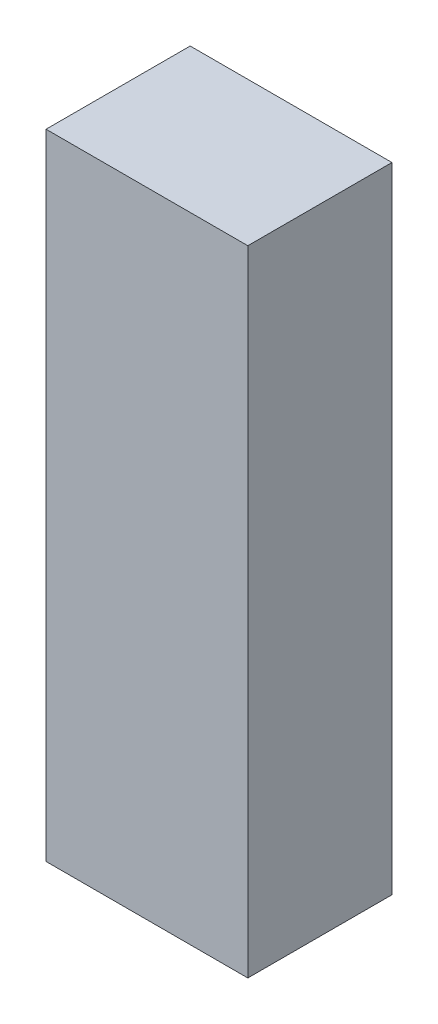
ISO-10303-21;
HEADER;
FILE_DESCRIPTION(('STEP AP214'),'2;1');
FILE_NAME('part.step','',(''),(''),'','','');
FILE_SCHEMA(('AUTOMOTIVE_DESIGN { 1 0 10303 214 1 1 1 1 }'));
ENDSEC;
DATA;
#1=APPLICATION_CONTEXT('core data for automotive mechanical design processes');
#2=APPLICATION_PROTOCOL_DEFINITION('international standard','automotive_design',2000,#1);
#3=PRODUCT_CONTEXT('',#1,'mechanical');
#4=PRODUCT('Part','Part','',(#3));
#5=PRODUCT_RELATED_PRODUCT_CATEGORY('part','',(#4));
#6=PRODUCT_DEFINITION_FORMATION('','',#4);
#7=PRODUCT_DEFINITION_CONTEXT('part definition',#1,'design');
#8=PRODUCT_DEFINITION('design','',#6,#7);
#9=PRODUCT_DEFINITION_SHAPE('','',#8);
#10=(LENGTH_UNIT() NAMED_UNIT(*) SI_UNIT(.MILLI.,.METRE.));
#11=(NAMED_UNIT(*) PLANE_ANGLE_UNIT() SI_UNIT($,.RADIAN.));
#12=(NAMED_UNIT(*) SI_UNIT($,.STERADIAN.) SOLID_ANGLE_UNIT());
#13=UNCERTAINTY_MEASURE_WITH_UNIT(LENGTH_MEASURE(1.E-05),#10,'distance_accuracy_value','');
#14=(GEOMETRIC_REPRESENTATION_CONTEXT(3) GLOBAL_UNCERTAINTY_ASSIGNED_CONTEXT((#13)) GLOBAL_UNIT_ASSIGNED_CONTEXT((#10,
#11,#12)) REPRESENTATION_CONTEXT('',''));
#15=CARTESIAN_POINT('',(0.,0.,0.));
#16=DIRECTION('',(0.,0.,1.));
#17=DIRECTION('',(1.,0.,0.));
#18=AXIS2_PLACEMENT_3D('',#15,#16,#17);
#19=CARTESIAN_POINT('',(0.,0.,25.));
#20=DIRECTION('',(0.,1.,0.));
#21=DIRECTION('',(0.,0.,1.));
#22=AXIS2_PLACEMENT_3D('',#19,#20,#21);
#23=PLANE('',#22);
#24=DIRECTION('',(1.,0.,0.));
#25=VECTOR('',#24,1.);
#26=CARTESIAN_POINT('',(0.,0.,0.));
#27=LINE('',#26,#25);
#28=CARTESIAN_POINT('',(0.,0.,0.));
#29=VERTEX_POINT('',#28);
#30=CARTESIAN_POINT('',(35.,0.,0.));
#31=VERTEX_POINT('',#30);
#32=EDGE_CURVE('E105',#29,#31,#27,.T.);
#33=ORIENTED_EDGE('',*,*,#32,.T.);
#34=DIRECTION('',(0.,0.,-1.));
#35=VECTOR('',#34,1.);
#36=CARTESIAN_POINT('',(35.,0.,25.));
#37=LINE('',#36,#35);
#38=CARTESIAN_POINT('',(35.,0.,25.));
#39=VERTEX_POINT('',#38);
#40=EDGE_CURVE('E11',#39,#31,#37,.T.);
#41=ORIENTED_EDGE('',*,*,#40,.F.);
#42=DIRECTION('',(1.,0.,0.));
#43=VECTOR('',#42,1.);
#44=CARTESIAN_POINT('',(0.,0.,25.));
#45=LINE('',#44,#43);
#46=CARTESIAN_POINT('',(0.,0.,25.));
#47=VERTEX_POINT('',#46);
#48=EDGE_CURVE('E89',#47,#39,#45,.T.);
#49=ORIENTED_EDGE('',*,*,#48,.F.);
#50=DIRECTION('',(0.,0.,-1.));
#51=VECTOR('',#50,1.);
#52=CARTESIAN_POINT('',(0.,0.,25.));
#53=LINE('',#52,#51);
#54=EDGE_CURVE('E97',#47,#29,#53,.T.);
#55=ORIENTED_EDGE('',*,*,#54,.T.);
#56=EDGE_LOOP('',(#33,#41,#49,#55));
#57=FACE_BOUND('',#56,.T.);
#58=ADVANCED_FACE('F39',(#57),#23,.F.);
#59=CARTESIAN_POINT('',(35.,0.,25.));
#60=DIRECTION('',(-1.,0.,0.));
#61=DIRECTION('',(0.,0.,1.));
#62=AXIS2_PLACEMENT_3D('',#59,#60,#61);
#63=PLANE('',#62);
#64=DIRECTION('',(0.,1.,0.));
#65=VECTOR('',#64,1.);
#66=CARTESIAN_POINT('',(35.,0.,0.));
#67=LINE('',#66,#65);
#68=CARTESIAN_POINT('',(35.,110.,0.));
#69=VERTEX_POINT('',#68);
#70=EDGE_CURVE('E92',#31,#69,#67,.T.);
#71=ORIENTED_EDGE('',*,*,#70,.T.);
#72=DIRECTION('',(0.,0.,-1.));
#73=VECTOR('',#72,1.);
#74=CARTESIAN_POINT('',(35.,110.,25.));
#75=LINE('',#74,#73);
#76=CARTESIAN_POINT('',(35.,110.,25.));
#77=VERTEX_POINT('',#76);
#78=EDGE_CURVE('E50',#77,#69,#75,.T.);
#79=ORIENTED_EDGE('',*,*,#78,.F.);
#80=DIRECTION('',(0.,1.,0.));
#81=VECTOR('',#80,1.);
#82=CARTESIAN_POINT('',(35.,0.,25.));
#83=LINE('',#82,#81);
#84=EDGE_CURVE('E82',#39,#77,#83,.T.);
#85=ORIENTED_EDGE('',*,*,#84,.F.);
#86=ORIENTED_EDGE('',*,*,#40,.T.);
#87=EDGE_LOOP('',(#71,#79,#85,#86));
#88=FACE_BOUND('',#87,.T.);
#89=ADVANCED_FACE('F93',(#88),#63,.F.);
#90=CARTESIAN_POINT('',(0.,110.,25.));
#91=DIRECTION('',(0.,-1.,0.));
#92=DIRECTION('',(0.,0.,-1.));
#93=AXIS2_PLACEMENT_3D('',#90,#91,#92);
#94=PLANE('',#93);
#95=DIRECTION('',(-1.,0.,0.));
#96=VECTOR('',#95,1.);
#97=CARTESIAN_POINT('',(0.,110.,0.));
#98=LINE('',#97,#96);
#99=CARTESIAN_POINT('',(0.,110.,0.));
#100=VERTEX_POINT('',#99);
#101=EDGE_CURVE('E72',#69,#100,#98,.T.);
#102=ORIENTED_EDGE('',*,*,#101,.T.);
#103=DIRECTION('',(0.,0.,-1.));
#104=VECTOR('',#103,1.);
#105=CARTESIAN_POINT('',(0.,110.,25.));
#106=LINE('',#105,#104);
#107=CARTESIAN_POINT('',(0.,110.,25.));
#108=VERTEX_POINT('',#107);
#109=EDGE_CURVE('E94',#108,#100,#106,.T.);
#110=ORIENTED_EDGE('',*,*,#109,.F.);
#111=DIRECTION('',(-1.,0.,0.));
#112=VECTOR('',#111,1.);
#113=CARTESIAN_POINT('',(0.,110.,25.));
#114=LINE('',#113,#112);
#115=EDGE_CURVE('E88',#77,#108,#114,.T.);
#116=ORIENTED_EDGE('',*,*,#115,.F.);
#117=ORIENTED_EDGE('',*,*,#78,.T.);
#118=EDGE_LOOP('',(#102,#110,#116,#117));
#119=FACE_BOUND('',#118,.T.);
#120=ADVANCED_FACE('F96',(#119),#94,.F.);
#121=CARTESIAN_POINT('',(0.,0.,25.));
#122=DIRECTION('',(1.,0.,0.));
#123=DIRECTION('',(0.,0.,-1.));
#124=AXIS2_PLACEMENT_3D('',#121,#122,#123);
#125=PLANE('',#124);
#126=DIRECTION('',(0.,-1.,0.));
#127=VECTOR('',#126,1.);
#128=CARTESIAN_POINT('',(0.,0.,0.));
#129=LINE('',#128,#127);
#130=EDGE_CURVE('E76',#100,#29,#129,.T.);
#131=ORIENTED_EDGE('',*,*,#130,.T.);
#132=ORIENTED_EDGE('',*,*,#54,.F.);
#133=DIRECTION('',(0.,-1.,0.));
#134=VECTOR('',#133,1.);
#135=CARTESIAN_POINT('',(0.,0.,25.));
#136=LINE('',#135,#134);
#137=EDGE_CURVE('E54',#108,#47,#136,.T.);
#138=ORIENTED_EDGE('',*,*,#137,.F.);
#139=ORIENTED_EDGE('',*,*,#109,.T.);
#140=EDGE_LOOP('',(#131,#132,#138,#139));
#141=FACE_BOUND('',#140,.T.);
#142=ADVANCED_FACE('F108',(#141),#125,.F.);
#143=CARTESIAN_POINT('',(0.,0.,25.));
#144=DIRECTION('',(0.,0.,1.));
#145=DIRECTION('',(1.,0.,0.));
#146=AXIS2_PLACEMENT_3D('',#143,#144,#145);
#147=PLANE('',#146);
#148=ORIENTED_EDGE('',*,*,#48,.T.);
#149=ORIENTED_EDGE('',*,*,#84,.T.);
#150=ORIENTED_EDGE('',*,*,#115,.T.);
#151=ORIENTED_EDGE('',*,*,#137,.T.);
#152=EDGE_LOOP('',(#148,#149,#150,#151));
#153=FACE_BOUND('',#152,.T.);
#154=ADVANCED_FACE('F86',(#153),#147,.T.);
#155=CARTESIAN_POINT('',(0.,0.,0.));
#156=DIRECTION('',(0.,0.,1.));
#157=DIRECTION('',(1.,0.,0.));
#158=AXIS2_PLACEMENT_3D('',#155,#156,#157);
#159=PLANE('',#158);
#160=ORIENTED_EDGE('',*,*,#32,.F.);
#161=ORIENTED_EDGE('',*,*,#130,.F.);
#162=ORIENTED_EDGE('',*,*,#101,.F.);
#163=ORIENTED_EDGE('',*,*,#70,.F.);
#164=EDGE_LOOP('',(#160,#161,#162,#163));
#165=FACE_BOUND('',#164,.T.);
#166=ADVANCED_FACE('F115',(#165),#159,.F.);
#167=CLOSED_SHELL('',(#58,#89,#120,#142,#154,#166));
#168=MANIFOLD_SOLID_BREP('B2',#167);
#169=ADVANCED_BREP_SHAPE_REPRESENTATION('',(#18,#168),#14);
#170=SHAPE_DEFINITION_REPRESENTATION(#9,#169);
ENDSEC;
END-ISO-10303-21;
